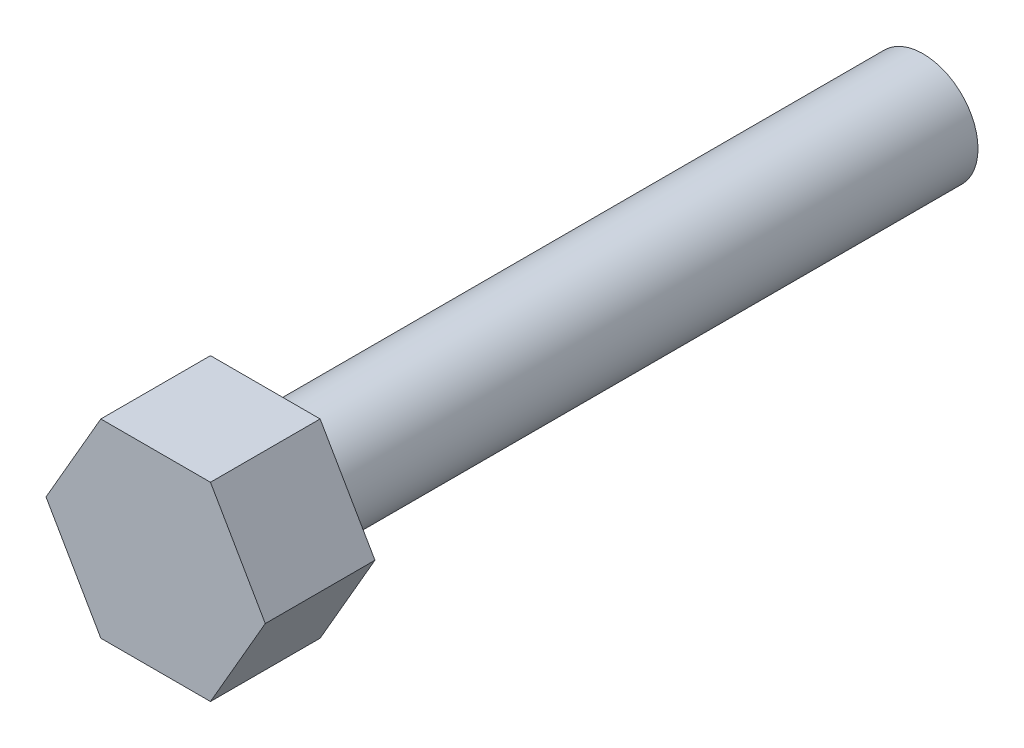
ISO-10303-21;
HEADER;
FILE_DESCRIPTION(('STEP AP214'),'2;1');
FILE_NAME('part.step','',(''),(''),'','','');
FILE_SCHEMA(('AUTOMOTIVE_DESIGN { 1 0 10303 214 1 1 1 1 }'));
ENDSEC;
DATA;
#1=APPLICATION_CONTEXT('core data for automotive mechanical design processes');
#2=APPLICATION_PROTOCOL_DEFINITION('international standard','automotive_design',2000,#1);
#3=PRODUCT_CONTEXT('',#1,'mechanical');
#4=PRODUCT('Part','Part','',(#3));
#5=PRODUCT_RELATED_PRODUCT_CATEGORY('part','',(#4));
#6=PRODUCT_DEFINITION_FORMATION('','',#4);
#7=PRODUCT_DEFINITION_CONTEXT('part definition',#1,'design');
#8=PRODUCT_DEFINITION('design','',#6,#7);
#9=PRODUCT_DEFINITION_SHAPE('','',#8);
#10=(LENGTH_UNIT() NAMED_UNIT(*) SI_UNIT(.MILLI.,.METRE.));
#11=(NAMED_UNIT(*) PLANE_ANGLE_UNIT() SI_UNIT($,.RADIAN.));
#12=(NAMED_UNIT(*) SI_UNIT($,.STERADIAN.) SOLID_ANGLE_UNIT());
#13=UNCERTAINTY_MEASURE_WITH_UNIT(LENGTH_MEASURE(1.E-05),#10,'distance_accuracy_value','');
#14=(GEOMETRIC_REPRESENTATION_CONTEXT(3) GLOBAL_UNCERTAINTY_ASSIGNED_CONTEXT((#13)) GLOBAL_UNIT_ASSIGNED_CONTEXT((#10,
#11,#12)) REPRESENTATION_CONTEXT('',''));
#15=CARTESIAN_POINT('',(0.,0.,0.));
#16=DIRECTION('',(0.,0.,1.));
#17=DIRECTION('',(1.,0.,0.));
#18=AXIS2_PLACEMENT_3D('',#15,#16,#17);
#19=CARTESIAN_POINT('',(0.,0.,30.));
#20=DIRECTION('',(0.,0.,-1.));
#21=DIRECTION('',(-1.,0.,0.));
#22=AXIS2_PLACEMENT_3D('',#19,#20,#21);
#23=CYLINDRICAL_SURFACE('',#22,2.5);
#24=CARTESIAN_POINT('',(0.,0.,30.));
#25=DIRECTION('',(0.,0.,1.));
#26=DIRECTION('',(1.,0.,0.));
#27=AXIS2_PLACEMENT_3D('',#24,#25,#26);
#28=CIRCLE('',#27,2.5);
#29=CARTESIAN_POINT('',(2.5,0.,30.));
#30=VERTEX_POINT('',#29);
#31=EDGE_CURVE('E11',#30,#30,#28,.T.);
#32=ORIENTED_EDGE('',*,*,#31,.F.);
#33=EDGE_LOOP('',(#32));
#34=FACE_BOUND('',#33,.T.);
#35=CARTESIAN_POINT('',(0.,0.,0.));
#36=DIRECTION('',(0.,0.,1.));
#37=DIRECTION('',(1.,0.,0.));
#38=AXIS2_PLACEMENT_3D('',#35,#36,#37);
#39=CIRCLE('',#38,2.5);
#40=CARTESIAN_POINT('',(2.5,0.,0.));
#41=VERTEX_POINT('',#40);
#42=EDGE_CURVE('E42',#41,#41,#39,.T.);
#43=ORIENTED_EDGE('',*,*,#42,.T.);
#44=EDGE_LOOP('',(#43));
#45=FACE_BOUND('',#44,.T.);
#46=ADVANCED_FACE('F39',(#34,#45),#23,.T.);
#47=CARTESIAN_POINT('',(0.,0.,0.));
#48=DIRECTION('',(0.,0.,1.));
#49=DIRECTION('',(1.,0.,0.));
#50=AXIS2_PLACEMENT_3D('',#47,#48,#49);
#51=PLANE('',#50);
#52=ORIENTED_EDGE('',*,*,#42,.F.);
#53=EDGE_LOOP('',(#52));
#54=FACE_BOUND('',#53,.T.);
#55=ADVANCED_FACE('F164',(#54),#51,.F.);
#56=CARTESIAN_POINT('',(2.5,-4.3301270189222,35.));
#57=DIRECTION('',(-0.866025403784439,0.5,0.));
#58=DIRECTION('',(-0.5,-0.866025403784439,0.));
#59=AXIS2_PLACEMENT_3D('',#56,#57,#58);
#60=PLANE('',#59);
#61=DIRECTION('',(0.5,0.866025403784439,0.));
#62=VECTOR('',#61,1.);
#63=CARTESIAN_POINT('',(2.5,-4.3301270189222,30.));
#64=LINE('',#63,#62);
#65=CARTESIAN_POINT('',(2.5,-4.3301270189222,30.));
#66=VERTEX_POINT('',#65);
#67=CARTESIAN_POINT('',(5.,0.,30.));
#68=VERTEX_POINT('',#67);
#69=EDGE_CURVE('E129',#66,#68,#64,.T.);
#70=ORIENTED_EDGE('',*,*,#69,.T.);
#71=DIRECTION('',(0.,0.,-1.));
#72=VECTOR('',#71,1.);
#73=CARTESIAN_POINT('',(5.,0.,35.));
#74=LINE('',#73,#72);
#75=CARTESIAN_POINT('',(5.,0.,35.));
#76=VERTEX_POINT('',#75);
#77=EDGE_CURVE('E156',#76,#68,#74,.T.);
#78=ORIENTED_EDGE('',*,*,#77,.F.);
#79=DIRECTION('',(0.5,0.866025403784439,0.));
#80=VECTOR('',#79,1.);
#81=CARTESIAN_POINT('',(2.5,-4.3301270189222,35.));
#82=LINE('',#81,#80);
#83=CARTESIAN_POINT('',(2.5,-4.3301270189222,35.));
#84=VERTEX_POINT('',#83);
#85=EDGE_CURVE('E145',#84,#76,#82,.T.);
#86=ORIENTED_EDGE('',*,*,#85,.F.);
#87=DIRECTION('',(0.,0.,-1.));
#88=VECTOR('',#87,1.);
#89=CARTESIAN_POINT('',(2.5,-4.3301270189222,35.));
#90=LINE('',#89,#88);
#91=EDGE_CURVE('E125',#84,#66,#90,.T.);
#92=ORIENTED_EDGE('',*,*,#91,.T.);
#93=EDGE_LOOP('',(#70,#78,#86,#92));
#94=FACE_BOUND('',#93,.T.);
#95=ADVANCED_FACE('F166',(#94),#60,.F.);
#96=CARTESIAN_POINT('',(5.,0.,35.));
#97=DIRECTION('',(-0.866025403784438,-0.5,0.));
#98=DIRECTION('',(0.5,-0.866025403784439,0.));
#99=AXIS2_PLACEMENT_3D('',#96,#97,#98);
#100=PLANE('',#99);
#101=DIRECTION('',(-0.5,0.866025403784439,0.));
#102=VECTOR('',#101,1.);
#103=CARTESIAN_POINT('',(5.,0.,30.));
#104=LINE('',#103,#102);
#105=CARTESIAN_POINT('',(2.5,4.3301270189222,30.));
#106=VERTEX_POINT('',#105);
#107=EDGE_CURVE('E133',#68,#106,#104,.T.);
#108=ORIENTED_EDGE('',*,*,#107,.T.);
#109=DIRECTION('',(0.,0.,-1.));
#110=VECTOR('',#109,1.);
#111=CARTESIAN_POINT('',(2.5,4.3301270189222,35.));
#112=LINE('',#111,#110);
#113=CARTESIAN_POINT('',(2.5,4.3301270189222,35.));
#114=VERTEX_POINT('',#113);
#115=EDGE_CURVE('E152',#114,#106,#112,.T.);
#116=ORIENTED_EDGE('',*,*,#115,.F.);
#117=DIRECTION('',(-0.5,0.866025403784439,0.));
#118=VECTOR('',#117,1.);
#119=CARTESIAN_POINT('',(5.,0.,35.));
#120=LINE('',#119,#118);
#121=EDGE_CURVE('E94',#76,#114,#120,.T.);
#122=ORIENTED_EDGE('',*,*,#121,.F.);
#123=ORIENTED_EDGE('',*,*,#77,.T.);
#124=EDGE_LOOP('',(#108,#116,#122,#123));
#125=FACE_BOUND('',#124,.T.);
#126=ADVANCED_FACE('F171',(#125),#100,.F.);
#127=CARTESIAN_POINT('',(2.5,4.3301270189222,35.));
#128=DIRECTION('',(0.,-1.,0.));
#129=DIRECTION('',(0.,0.,-1.));
#130=AXIS2_PLACEMENT_3D('',#127,#128,#129);
#131=PLANE('',#130);
#132=DIRECTION('',(-1.,0.,0.));
#133=VECTOR('',#132,1.);
#134=CARTESIAN_POINT('',(2.5,4.3301270189222,30.));
#135=LINE('',#134,#133);
#136=CARTESIAN_POINT('',(-2.5,4.3301270189222,30.));
#137=VERTEX_POINT('',#136);
#138=EDGE_CURVE('E136',#106,#137,#135,.T.);
#139=ORIENTED_EDGE('',*,*,#138,.T.);
#140=DIRECTION('',(0.,0.,-1.));
#141=VECTOR('',#140,1.);
#142=CARTESIAN_POINT('',(-2.5,4.3301270189222,35.));
#143=LINE('',#142,#141);
#144=CARTESIAN_POINT('',(-2.5,4.3301270189222,35.));
#145=VERTEX_POINT('',#144);
#146=EDGE_CURVE('E118',#145,#137,#143,.T.);
#147=ORIENTED_EDGE('',*,*,#146,.F.);
#148=DIRECTION('',(-1.,0.,0.));
#149=VECTOR('',#148,1.);
#150=CARTESIAN_POINT('',(2.5,4.3301270189222,35.));
#151=LINE('',#150,#149);
#152=EDGE_CURVE('E107',#114,#145,#151,.T.);
#153=ORIENTED_EDGE('',*,*,#152,.F.);
#154=ORIENTED_EDGE('',*,*,#115,.T.);
#155=EDGE_LOOP('',(#139,#147,#153,#154));
#156=FACE_BOUND('',#155,.T.);
#157=ADVANCED_FACE('F178',(#156),#131,.F.);
#158=CARTESIAN_POINT('',(-2.5,4.3301270189222,35.));
#159=DIRECTION('',(0.866025403784439,-0.5,0.));
#160=DIRECTION('',(0.5,0.866025403784439,0.));
#161=AXIS2_PLACEMENT_3D('',#158,#159,#160);
#162=PLANE('',#161);
#163=DIRECTION('',(-0.5,-0.866025403784439,0.));
#164=VECTOR('',#163,1.);
#165=CARTESIAN_POINT('',(-2.5,4.3301270189222,30.));
#166=LINE('',#165,#164);
#167=CARTESIAN_POINT('',(-5.,0.,30.));
#168=VERTEX_POINT('',#167);
#169=EDGE_CURVE('E116',#137,#168,#166,.T.);
#170=ORIENTED_EDGE('',*,*,#169,.T.);
#171=DIRECTION('',(0.,0.,-1.));
#172=VECTOR('',#171,1.);
#173=CARTESIAN_POINT('',(-5.,0.,35.));
#174=LINE('',#173,#172);
#175=CARTESIAN_POINT('',(-5.,0.,35.));
#176=VERTEX_POINT('',#175);
#177=EDGE_CURVE('E113',#176,#168,#174,.T.);
#178=ORIENTED_EDGE('',*,*,#177,.F.);
#179=DIRECTION('',(-0.5,-0.866025403784439,0.));
#180=VECTOR('',#179,1.);
#181=CARTESIAN_POINT('',(-2.5,4.3301270189222,35.));
#182=LINE('',#181,#180);
#183=EDGE_CURVE('E101',#145,#176,#182,.T.);
#184=ORIENTED_EDGE('',*,*,#183,.F.);
#185=ORIENTED_EDGE('',*,*,#146,.T.);
#186=EDGE_LOOP('',(#170,#178,#184,#185));
#187=FACE_BOUND('',#186,.T.);
#188=ADVANCED_FACE('F114',(#187),#162,.F.);
#189=CARTESIAN_POINT('',(-5.,0.,35.));
#190=DIRECTION('',(0.866025403784439,0.5,0.));
#191=DIRECTION('',(-0.5,0.866025403784439,0.));
#192=AXIS2_PLACEMENT_3D('',#189,#190,#191);
#193=PLANE('',#192);
#194=DIRECTION('',(0.5,-0.866025403784439,0.));
#195=VECTOR('',#194,1.);
#196=CARTESIAN_POINT('',(-5.,0.,30.));
#197=LINE('',#196,#195);
#198=CARTESIAN_POINT('',(-2.5,-4.3301270189222,30.));
#199=VERTEX_POINT('',#198);
#200=EDGE_CURVE('E79',#168,#199,#197,.T.);
#201=ORIENTED_EDGE('',*,*,#200,.T.);
#202=DIRECTION('',(0.,0.,-1.));
#203=VECTOR('',#202,1.);
#204=CARTESIAN_POINT('',(-2.5,-4.3301270189222,35.));
#205=LINE('',#204,#203);
#206=CARTESIAN_POINT('',(-2.5,-4.3301270189222,35.));
#207=VERTEX_POINT('',#206);
#208=EDGE_CURVE('E119',#207,#199,#205,.T.);
#209=ORIENTED_EDGE('',*,*,#208,.F.);
#210=DIRECTION('',(0.5,-0.866025403784439,0.));
#211=VECTOR('',#210,1.);
#212=CARTESIAN_POINT('',(-5.,0.,35.));
#213=LINE('',#212,#211);
#214=EDGE_CURVE('E105',#176,#207,#213,.T.);
#215=ORIENTED_EDGE('',*,*,#214,.F.);
#216=ORIENTED_EDGE('',*,*,#177,.T.);
#217=EDGE_LOOP('',(#201,#209,#215,#216));
#218=FACE_BOUND('',#217,.T.);
#219=ADVANCED_FACE('F121',(#218),#193,.F.);
#220=CARTESIAN_POINT('',(-2.5,-4.3301270189222,35.));
#221=DIRECTION('',(0.,1.,0.));
#222=DIRECTION('',(-1.,0.,0.));
#223=AXIS2_PLACEMENT_3D('',#220,#221,#222);
#224=PLANE('',#223);
#225=DIRECTION('',(1.,0.,0.));
#226=VECTOR('',#225,1.);
#227=CARTESIAN_POINT('',(-2.5,-4.3301270189222,30.));
#228=LINE('',#227,#226);
#229=EDGE_CURVE('E85',#199,#66,#228,.T.);
#230=ORIENTED_EDGE('',*,*,#229,.T.);
#231=ORIENTED_EDGE('',*,*,#91,.F.);
#232=DIRECTION('',(1.,0.,0.));
#233=VECTOR('',#232,1.);
#234=CARTESIAN_POINT('',(-2.5,-4.3301270189222,35.));
#235=LINE('',#234,#233);
#236=EDGE_CURVE('E56',#207,#84,#235,.T.);
#237=ORIENTED_EDGE('',*,*,#236,.F.);
#238=ORIENTED_EDGE('',*,*,#208,.T.);
#239=EDGE_LOOP('',(#230,#231,#237,#238));
#240=FACE_BOUND('',#239,.T.);
#241=ADVANCED_FACE('F186',(#240),#224,.F.);
#242=CARTESIAN_POINT('',(0.,0.,35.));
#243=DIRECTION('',(0.,0.,1.));
#244=DIRECTION('',(1.,0.,0.));
#245=AXIS2_PLACEMENT_3D('',#242,#243,#244);
#246=PLANE('',#245);
#247=ORIENTED_EDGE('',*,*,#85,.T.);
#248=ORIENTED_EDGE('',*,*,#121,.T.);
#249=ORIENTED_EDGE('',*,*,#152,.T.);
#250=ORIENTED_EDGE('',*,*,#183,.T.);
#251=ORIENTED_EDGE('',*,*,#214,.T.);
#252=ORIENTED_EDGE('',*,*,#236,.T.);
#253=EDGE_LOOP('',(#247,#248,#249,#250,#251,#252));
#254=FACE_BOUND('',#253,.T.);
#255=ADVANCED_FACE('F103',(#254),#246,.T.);
#256=CARTESIAN_POINT('',(0.,0.,30.));
#257=DIRECTION('',(0.,0.,1.));
#258=DIRECTION('',(1.,0.,0.));
#259=AXIS2_PLACEMENT_3D('',#256,#257,#258);
#260=PLANE('',#259);
#261=ORIENTED_EDGE('',*,*,#31,.T.);
#262=EDGE_LOOP('',(#261));
#263=FACE_BOUND('',#262,.T.);
#264=ORIENTED_EDGE('',*,*,#69,.F.);
#265=ORIENTED_EDGE('',*,*,#229,.F.);
#266=ORIENTED_EDGE('',*,*,#200,.F.);
#267=ORIENTED_EDGE('',*,*,#169,.F.);
#268=ORIENTED_EDGE('',*,*,#138,.F.);
#269=ORIENTED_EDGE('',*,*,#107,.F.);
#270=EDGE_LOOP('',(#264,#265,#266,#267,#268,#269));
#271=FACE_BOUND('',#270,.T.);
#272=ADVANCED_FACE('F189',(#263,#271),#260,.F.);
#273=CLOSED_SHELL('',(#46,#55,#95,#126,#157,#188,#219,#241,#255,#272));
#274=MANIFOLD_SOLID_BREP('B2',#273);
#275=ADVANCED_BREP_SHAPE_REPRESENTATION('',(#18,#274),#14);
#276=SHAPE_DEFINITION_REPRESENTATION(#9,#275);
ENDSEC;
END-ISO-10303-21;
